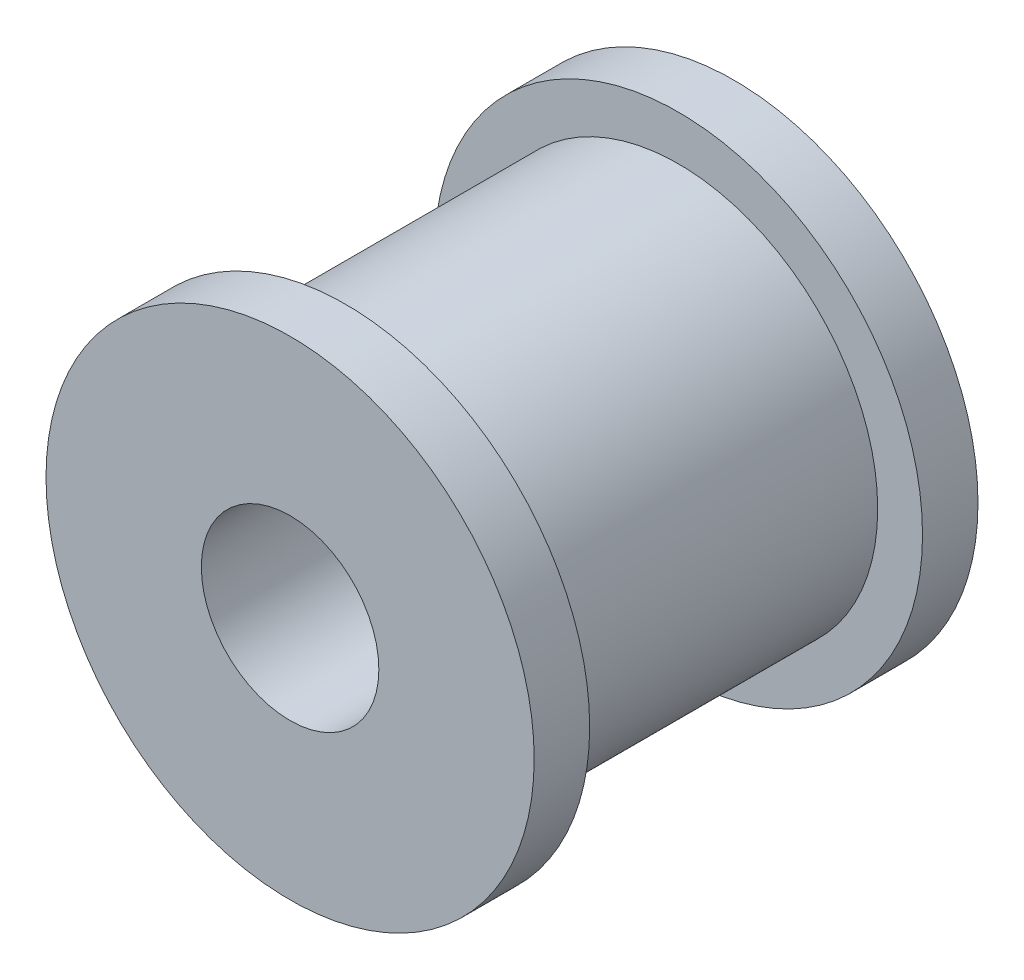
ISO-10303-21;
HEADER;
FILE_DESCRIPTION(('STEP AP214'),'2;1');
FILE_NAME('part.step','',(''),(''),'','','');
FILE_SCHEMA(('AUTOMOTIVE_DESIGN { 1 0 10303 214 1 1 1 1 }'));
ENDSEC;
DATA;
#1=APPLICATION_CONTEXT('core data for automotive mechanical design processes');
#2=APPLICATION_PROTOCOL_DEFINITION('international standard','automotive_design',2000,#1);
#3=PRODUCT_CONTEXT('',#1,'mechanical');
#4=PRODUCT('Part','Part','',(#3));
#5=PRODUCT_RELATED_PRODUCT_CATEGORY('part','',(#4));
#6=PRODUCT_DEFINITION_FORMATION('','',#4);
#7=PRODUCT_DEFINITION_CONTEXT('part definition',#1,'design');
#8=PRODUCT_DEFINITION('design','',#6,#7);
#9=PRODUCT_DEFINITION_SHAPE('','',#8);
#10=(LENGTH_UNIT() NAMED_UNIT(*) SI_UNIT(.MILLI.,.METRE.));
#11=(NAMED_UNIT(*) PLANE_ANGLE_UNIT() SI_UNIT($,.RADIAN.));
#12=(NAMED_UNIT(*) SI_UNIT($,.STERADIAN.) SOLID_ANGLE_UNIT());
#13=UNCERTAINTY_MEASURE_WITH_UNIT(LENGTH_MEASURE(1.E-05),#10,'distance_accuracy_value','');
#14=(GEOMETRIC_REPRESENTATION_CONTEXT(3) GLOBAL_UNCERTAINTY_ASSIGNED_CONTEXT((#13)) GLOBAL_UNIT_ASSIGNED_CONTEXT((#10,
#11,#12)) REPRESENTATION_CONTEXT('',''));
#15=CARTESIAN_POINT('',(0.,0.,0.));
#16=DIRECTION('',(0.,0.,1.));
#17=DIRECTION('',(1.,0.,0.));
#18=AXIS2_PLACEMENT_3D('',#15,#16,#17);
#19=CARTESIAN_POINT('',(0.,0.,0.));
#20=DIRECTION('',(0.,0.,-1.));
#21=DIRECTION('',(0.,-1.,0.));
#22=AXIS2_PLACEMENT_3D('',#19,#20,#21);
#23=PLANE('',#22);
#24=CARTESIAN_POINT('',(0.,0.,0.));
#25=DIRECTION('',(0.,0.,-1.));
#26=DIRECTION('',(-1.,0.,0.));
#27=AXIS2_PLACEMENT_3D('',#24,#25,#26);
#28=CIRCLE('',#27,4.);
#29=CARTESIAN_POINT('',(-4.,0.,0.));
#30=VERTEX_POINT('',#29);
#31=EDGE_CURVE('E39',#30,#30,#28,.T.);
#32=ORIENTED_EDGE('',*,*,#31,.F.);
#33=EDGE_LOOP('',(#32));
#34=FACE_BOUND('',#33,.T.);
#35=CARTESIAN_POINT('',(0.,0.,0.));
#36=DIRECTION('',(0.,0.,1.));
#37=DIRECTION('',(1.,0.,0.));
#38=AXIS2_PLACEMENT_3D('',#35,#36,#37);
#39=CIRCLE('',#38,11.);
#40=CARTESIAN_POINT('',(11.,0.,0.));
#41=VERTEX_POINT('',#40);
#42=EDGE_CURVE('E27',#41,#41,#39,.T.);
#43=ORIENTED_EDGE('',*,*,#42,.F.);
#44=EDGE_LOOP('',(#43));
#45=FACE_BOUND('',#44,.T.);
#46=ADVANCED_FACE('F16',(#34,#45),#23,.T.);
#47=CARTESIAN_POINT('',(0.,0.,0.));
#48=DIRECTION('',(0.,0.,1.));
#49=DIRECTION('',(1.,0.,0.));
#50=AXIS2_PLACEMENT_3D('',#47,#48,#49);
#51=CYLINDRICAL_SURFACE('',#50,11.);
#52=CARTESIAN_POINT('',(0.,0.,2.5));
#53=DIRECTION('',(0.,0.,-1.));
#54=DIRECTION('',(1.,0.,0.));
#55=AXIS2_PLACEMENT_3D('',#52,#53,#54);
#56=CIRCLE('',#55,11.);
#57=CARTESIAN_POINT('',(11.,0.,2.5));
#58=VERTEX_POINT('',#57);
#59=EDGE_CURVE('E11',#58,#58,#56,.T.);
#60=ORIENTED_EDGE('',*,*,#59,.T.);
#61=EDGE_LOOP('',(#60));
#62=FACE_BOUND('',#61,.T.);
#63=ORIENTED_EDGE('',*,*,#42,.T.);
#64=EDGE_LOOP('',(#63));
#65=FACE_BOUND('',#64,.T.);
#66=ADVANCED_FACE('F114',(#62,#65),#51,.T.);
#67=CARTESIAN_POINT('',(0.,0.,2.5));
#68=DIRECTION('',(0.,0.,1.));
#69=DIRECTION('',(1.,0.,0.));
#70=AXIS2_PLACEMENT_3D('',#67,#68,#69);
#71=CYLINDRICAL_SURFACE('',#70,8.98);
#72=CARTESIAN_POINT('',(0.,0.,2.5));
#73=DIRECTION('',(0.,0.,-1.));
#74=DIRECTION('',(1.,0.,0.));
#75=AXIS2_PLACEMENT_3D('',#72,#73,#74);
#76=CIRCLE('',#75,8.98);
#77=CARTESIAN_POINT('',(8.98,0.,2.5));
#78=VERTEX_POINT('',#77);
#79=EDGE_CURVE('E85',#78,#78,#76,.T.);
#80=ORIENTED_EDGE('',*,*,#79,.F.);
#81=EDGE_LOOP('',(#80));
#82=FACE_BOUND('',#81,.T.);
#83=CARTESIAN_POINT('',(0.,0.,17.5));
#84=DIRECTION('',(0.,0.,-1.));
#85=DIRECTION('',(1.,0.,0.));
#86=AXIS2_PLACEMENT_3D('',#83,#84,#85);
#87=CIRCLE('',#86,8.98);
#88=CARTESIAN_POINT('',(8.98,0.,17.5));
#89=VERTEX_POINT('',#88);
#90=EDGE_CURVE('E79',#89,#89,#87,.T.);
#91=ORIENTED_EDGE('',*,*,#90,.T.);
#92=EDGE_LOOP('',(#91));
#93=FACE_BOUND('',#92,.T.);
#94=ADVANCED_FACE('F119',(#82,#93),#71,.T.);
#95=CARTESIAN_POINT('',(0.,0.,2.5));
#96=DIRECTION('',(0.,0.,-1.));
#97=DIRECTION('',(0.,-1.,0.));
#98=AXIS2_PLACEMENT_3D('',#95,#96,#97);
#99=PLANE('',#98);
#100=ORIENTED_EDGE('',*,*,#59,.F.);
#101=EDGE_LOOP('',(#100));
#102=FACE_BOUND('',#101,.T.);
#103=ORIENTED_EDGE('',*,*,#79,.T.);
#104=EDGE_LOOP('',(#103));
#105=FACE_BOUND('',#104,.T.);
#106=ADVANCED_FACE('F126',(#102,#105),#99,.F.);
#107=CARTESIAN_POINT('',(0.,0.,17.5));
#108=DIRECTION('',(0.,0.,-1.));
#109=DIRECTION('',(0.,-1.,0.));
#110=AXIS2_PLACEMENT_3D('',#107,#108,#109);
#111=PLANE('',#110);
#112=CARTESIAN_POINT('',(0.,0.,17.5));
#113=DIRECTION('',(0.,0.,-1.));
#114=DIRECTION('',(1.,0.,0.));
#115=AXIS2_PLACEMENT_3D('',#112,#113,#114);
#116=CIRCLE('',#115,11.);
#117=CARTESIAN_POINT('',(11.,0.,17.5));
#118=VERTEX_POINT('',#117);
#119=EDGE_CURVE('E70',#118,#118,#116,.T.);
#120=ORIENTED_EDGE('',*,*,#119,.T.);
#121=EDGE_LOOP('',(#120));
#122=FACE_BOUND('',#121,.T.);
#123=ORIENTED_EDGE('',*,*,#90,.F.);
#124=EDGE_LOOP('',(#123));
#125=FACE_BOUND('',#124,.T.);
#126=ADVANCED_FACE('F99',(#122,#125),#111,.T.);
#127=CARTESIAN_POINT('',(0.,0.,20.));
#128=DIRECTION('',(0.,0.,1.));
#129=DIRECTION('',(1.,0.,0.));
#130=AXIS2_PLACEMENT_3D('',#127,#128,#129);
#131=PLANE('',#130);
#132=CARTESIAN_POINT('',(0.,0.,20.));
#133=DIRECTION('',(0.,0.,-1.));
#134=DIRECTION('',(-1.,0.,0.));
#135=AXIS2_PLACEMENT_3D('',#132,#133,#134);
#136=CIRCLE('',#135,4.);
#137=CARTESIAN_POINT('',(-4.,0.,20.));
#138=VERTEX_POINT('',#137);
#139=EDGE_CURVE('E56',#138,#138,#136,.T.);
#140=ORIENTED_EDGE('',*,*,#139,.T.);
#141=EDGE_LOOP('',(#140));
#142=FACE_BOUND('',#141,.T.);
#143=CARTESIAN_POINT('',(0.,0.,20.));
#144=DIRECTION('',(0.,0.,-1.));
#145=DIRECTION('',(1.,0.,0.));
#146=AXIS2_PLACEMENT_3D('',#143,#144,#145);
#147=CIRCLE('',#146,11.);
#148=CARTESIAN_POINT('',(11.,0.,20.));
#149=VERTEX_POINT('',#148);
#150=EDGE_CURVE('E20',#149,#149,#147,.T.);
#151=ORIENTED_EDGE('',*,*,#150,.F.);
#152=EDGE_LOOP('',(#151));
#153=FACE_BOUND('',#152,.T.);
#154=ADVANCED_FACE('F18',(#142,#153),#131,.T.);
#155=CARTESIAN_POINT('',(0.,0.,0.));
#156=DIRECTION('',(0.,0.,1.));
#157=DIRECTION('',(1.,0.,0.));
#158=AXIS2_PLACEMENT_3D('',#155,#156,#157);
#159=CYLINDRICAL_SURFACE('',#158,11.);
#160=ORIENTED_EDGE('',*,*,#150,.T.);
#161=EDGE_LOOP('',(#160));
#162=FACE_BOUND('',#161,.T.);
#163=ORIENTED_EDGE('',*,*,#119,.F.);
#164=EDGE_LOOP('',(#163));
#165=FACE_BOUND('',#164,.T.);
#166=ADVANCED_FACE('F102',(#162,#165),#159,.T.);
#167=CARTESIAN_POINT('',(0.,0.,20.));
#168=DIRECTION('',(0.,0.,-1.));
#169=DIRECTION('',(-1.,0.,0.));
#170=AXIS2_PLACEMENT_3D('',#167,#168,#169);
#171=CYLINDRICAL_SURFACE('',#170,4.);
#172=ORIENTED_EDGE('',*,*,#31,.T.);
#173=EDGE_LOOP('',(#172));
#174=FACE_BOUND('',#173,.T.);
#175=ORIENTED_EDGE('',*,*,#139,.F.);
#176=EDGE_LOOP('',(#175));
#177=FACE_BOUND('',#176,.T.);
#178=ADVANCED_FACE('F104',(#174,#177),#171,.F.);
#179=CLOSED_SHELL('',(#46,#66,#94,#106,#126,#154,#166,#178));
#180=MANIFOLD_SOLID_BREP('B1',#179);
#181=ADVANCED_BREP_SHAPE_REPRESENTATION('',(#18,#180),#14);
#182=SHAPE_DEFINITION_REPRESENTATION(#9,#181);
ENDSEC;
END-ISO-10303-21;
